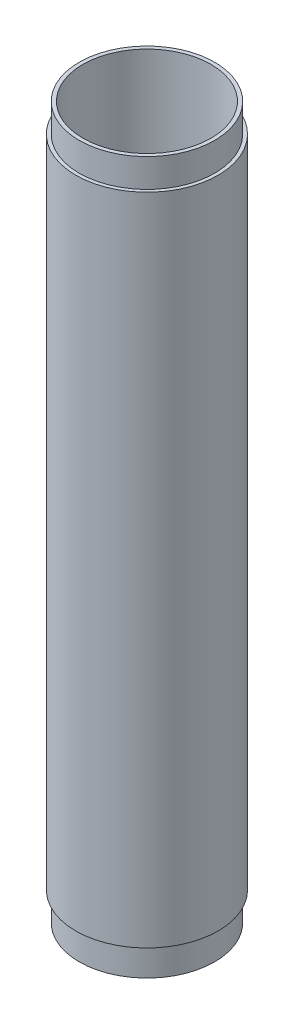
ISO-10303-21;
HEADER;
FILE_DESCRIPTION(('STEP AP214'),'2;1');
FILE_NAME('part.step','',(''),(''),'','','');
FILE_SCHEMA(('AUTOMOTIVE_DESIGN { 1 0 10303 214 1 1 1 1 }'));
ENDSEC;
DATA;
#1=APPLICATION_CONTEXT('core data for automotive mechanical design processes');
#2=APPLICATION_PROTOCOL_DEFINITION('international standard','automotive_design',2000,#1);
#3=PRODUCT_CONTEXT('',#1,'mechanical');
#4=PRODUCT('Part','Part','',(#3));
#5=PRODUCT_RELATED_PRODUCT_CATEGORY('part','',(#4));
#6=PRODUCT_DEFINITION_FORMATION('','',#4);
#7=PRODUCT_DEFINITION_CONTEXT('part definition',#1,'design');
#8=PRODUCT_DEFINITION('design','',#6,#7);
#9=PRODUCT_DEFINITION_SHAPE('','',#8);
#10=(LENGTH_UNIT() NAMED_UNIT(*) SI_UNIT(.MILLI.,.METRE.));
#11=(NAMED_UNIT(*) PLANE_ANGLE_UNIT() SI_UNIT($,.RADIAN.));
#12=(NAMED_UNIT(*) SI_UNIT($,.STERADIAN.) SOLID_ANGLE_UNIT());
#13=UNCERTAINTY_MEASURE_WITH_UNIT(LENGTH_MEASURE(1.E-05),#10,'distance_accuracy_value','');
#14=(GEOMETRIC_REPRESENTATION_CONTEXT(3) GLOBAL_UNCERTAINTY_ASSIGNED_CONTEXT((#13)) GLOBAL_UNIT_ASSIGNED_CONTEXT((#10,
#11,#12)) REPRESENTATION_CONTEXT('',''));
#15=CARTESIAN_POINT('',(0.,0.,0.));
#16=DIRECTION('',(0.,0.,1.));
#17=DIRECTION('',(1.,0.,0.));
#18=AXIS2_PLACEMENT_3D('',#15,#16,#17);
#19=CARTESIAN_POINT('',(0.,0.,0.));
#20=DIRECTION('',(0.,1.,0.));
#21=DIRECTION('',(0.,0.,1.));
#22=AXIS2_PLACEMENT_3D('',#19,#20,#21);
#23=PLANE('',#22);
#24=CARTESIAN_POINT('',(0.,0.,0.));
#25=DIRECTION('',(0.,1.,0.));
#26=DIRECTION('',(0.,0.,1.));
#27=AXIS2_PLACEMENT_3D('',#24,#25,#26);
#28=CIRCLE('',#27,25.);
#29=CARTESIAN_POINT('',(0.,0.,25.));
#30=VERTEX_POINT('',#29);
#31=EDGE_CURVE('E46',#30,#30,#28,.T.);
#32=ORIENTED_EDGE('',*,*,#31,.F.);
#33=EDGE_LOOP('',(#32));
#34=FACE_BOUND('',#33,.T.);
#35=CARTESIAN_POINT('',(0.,0.,0.));
#36=DIRECTION('',(0.,1.,0.));
#37=DIRECTION('',(0.,0.,1.));
#38=AXIS2_PLACEMENT_3D('',#35,#36,#37);
#39=CIRCLE('',#38,23.8);
#40=CARTESIAN_POINT('',(0.,0.,23.8));
#41=VERTEX_POINT('',#40);
#42=EDGE_CURVE('E10',#41,#41,#39,.F.);
#43=ORIENTED_EDGE('',*,*,#42,.F.);
#44=EDGE_LOOP('',(#43));
#45=FACE_BOUND('',#44,.T.);
#46=ADVANCED_FACE('F35',(#34,#45),#23,.F.);
#47=CARTESIAN_POINT('',(0.,230.,0.));
#48=DIRECTION('',(0.,1.,0.));
#49=DIRECTION('',(0.,0.,1.));
#50=AXIS2_PLACEMENT_3D('',#47,#48,#49);
#51=PLANE('',#50);
#52=CARTESIAN_POINT('',(0.,230.,0.));
#53=DIRECTION('',(0.,1.,0.));
#54=DIRECTION('',(0.,0.,1.));
#55=AXIS2_PLACEMENT_3D('',#52,#53,#54);
#56=CIRCLE('',#55,25.);
#57=CARTESIAN_POINT('',(0.,230.,25.));
#58=VERTEX_POINT('',#57);
#59=EDGE_CURVE('E42',#58,#58,#56,.T.);
#60=ORIENTED_EDGE('',*,*,#59,.T.);
#61=EDGE_LOOP('',(#60));
#62=FACE_BOUND('',#61,.T.);
#63=CARTESIAN_POINT('',(0.,230.,0.));
#64=DIRECTION('',(0.,1.,0.));
#65=DIRECTION('',(0.,0.,1.));
#66=AXIS2_PLACEMENT_3D('',#63,#64,#65);
#67=CIRCLE('',#66,23.8);
#68=CARTESIAN_POINT('',(0.,230.,23.8));
#69=VERTEX_POINT('',#68);
#70=EDGE_CURVE('E53',#69,#69,#67,.T.);
#71=ORIENTED_EDGE('',*,*,#70,.F.);
#72=EDGE_LOOP('',(#71));
#73=FACE_BOUND('',#72,.T.);
#74=ADVANCED_FACE('F86',(#62,#73),#51,.T.);
#75=CARTESIAN_POINT('',(0.,230.,0.));
#76=DIRECTION('',(0.,-1.,0.));
#77=DIRECTION('',(0.,0.,-1.));
#78=AXIS2_PLACEMENT_3D('',#75,#76,#77);
#79=CYLINDRICAL_SURFACE('',#78,25.);
#80=ORIENTED_EDGE('',*,*,#59,.F.);
#81=EDGE_LOOP('',(#80));
#82=FACE_BOUND('',#81,.T.);
#83=ORIENTED_EDGE('',*,*,#31,.T.);
#84=EDGE_LOOP('',(#83));
#85=FACE_BOUND('',#84,.T.);
#86=ADVANCED_FACE('F37',(#82,#85),#79,.T.);
#87=CARTESIAN_POINT('',(0.,230.,0.));
#88=DIRECTION('',(0.,-1.,0.));
#89=DIRECTION('',(0.,0.,-1.));
#90=AXIS2_PLACEMENT_3D('',#87,#88,#89);
#91=CYLINDRICAL_SURFACE('',#90,22.5);
#92=CARTESIAN_POINT('',(0.,240.,0.));
#93=DIRECTION('',(0.,1.,0.));
#94=DIRECTION('',(0.,0.,1.));
#95=AXIS2_PLACEMENT_3D('',#92,#93,#94);
#96=CIRCLE('',#95,22.5);
#97=CARTESIAN_POINT('',(0.,240.,22.5));
#98=VERTEX_POINT('',#97);
#99=EDGE_CURVE('E56',#98,#98,#96,.T.);
#100=ORIENTED_EDGE('',*,*,#99,.T.);
#101=EDGE_LOOP('',(#100));
#102=FACE_BOUND('',#101,.T.);
#103=CARTESIAN_POINT('',(0.,-10.,0.));
#104=DIRECTION('',(0.,-1.,0.));
#105=DIRECTION('',(0.,0.,-1.));
#106=AXIS2_PLACEMENT_3D('',#103,#104,#105);
#107=CIRCLE('',#106,22.5);
#108=CARTESIAN_POINT('',(0.,-10.,-22.5));
#109=VERTEX_POINT('',#108);
#110=EDGE_CURVE('E64',#109,#109,#107,.T.);
#111=ORIENTED_EDGE('',*,*,#110,.T.);
#112=EDGE_LOOP('',(#111));
#113=FACE_BOUND('',#112,.T.);
#114=ADVANCED_FACE('F68',(#102,#113),#91,.F.);
#115=CARTESIAN_POINT('',(0.,240.,0.));
#116=DIRECTION('',(0.,1.,0.));
#117=DIRECTION('',(0.,0.,1.));
#118=AXIS2_PLACEMENT_3D('',#115,#116,#117);
#119=PLANE('',#118);
#120=CARTESIAN_POINT('',(0.,240.,0.));
#121=DIRECTION('',(0.,1.,0.));
#122=DIRECTION('',(0.,0.,1.));
#123=AXIS2_PLACEMENT_3D('',#120,#121,#122);
#124=CIRCLE('',#123,23.8);
#125=CARTESIAN_POINT('',(0.,240.,23.8));
#126=VERTEX_POINT('',#125);
#127=EDGE_CURVE('E51',#126,#126,#124,.T.);
#128=ORIENTED_EDGE('',*,*,#127,.T.);
#129=EDGE_LOOP('',(#128));
#130=FACE_BOUND('',#129,.T.);
#131=ORIENTED_EDGE('',*,*,#99,.F.);
#132=EDGE_LOOP('',(#131));
#133=FACE_BOUND('',#132,.T.);
#134=ADVANCED_FACE('F82',(#130,#133),#119,.T.);
#135=CARTESIAN_POINT('',(0.,240.,0.));
#136=DIRECTION('',(0.,-1.,0.));
#137=DIRECTION('',(0.,0.,-1.));
#138=AXIS2_PLACEMENT_3D('',#135,#136,#137);
#139=CYLINDRICAL_SURFACE('',#138,23.8);
#140=ORIENTED_EDGE('',*,*,#127,.F.);
#141=EDGE_LOOP('',(#140));
#142=FACE_BOUND('',#141,.T.);
#143=ORIENTED_EDGE('',*,*,#70,.T.);
#144=EDGE_LOOP('',(#143));
#145=FACE_BOUND('',#144,.T.);
#146=ADVANCED_FACE('F73',(#142,#145),#139,.T.);
#147=CARTESIAN_POINT('',(0.,-10.,0.));
#148=DIRECTION('',(0.,-1.,0.));
#149=DIRECTION('',(0.,0.,-1.));
#150=AXIS2_PLACEMENT_3D('',#147,#148,#149);
#151=PLANE('',#150);
#152=CARTESIAN_POINT('',(0.,-10.,0.));
#153=DIRECTION('',(0.,-1.,0.));
#154=DIRECTION('',(0.,0.,-1.));
#155=AXIS2_PLACEMENT_3D('',#152,#153,#154);
#156=CIRCLE('',#155,23.8);
#157=CARTESIAN_POINT('',(0.,-10.,-23.8));
#158=VERTEX_POINT('',#157);
#159=EDGE_CURVE('E61',#158,#158,#156,.T.);
#160=ORIENTED_EDGE('',*,*,#159,.T.);
#161=EDGE_LOOP('',(#160));
#162=FACE_BOUND('',#161,.T.);
#163=ORIENTED_EDGE('',*,*,#110,.F.);
#164=EDGE_LOOP('',(#163));
#165=FACE_BOUND('',#164,.T.);
#166=ADVANCED_FACE('F70',(#162,#165),#151,.T.);
#167=CARTESIAN_POINT('',(0.,-10.,0.));
#168=DIRECTION('',(0.,1.,0.));
#169=DIRECTION('',(0.,0.,1.));
#170=AXIS2_PLACEMENT_3D('',#167,#168,#169);
#171=CYLINDRICAL_SURFACE('',#170,23.8);
#172=ORIENTED_EDGE('',*,*,#159,.F.);
#173=EDGE_LOOP('',(#172));
#174=FACE_BOUND('',#173,.T.);
#175=ORIENTED_EDGE('',*,*,#42,.T.);
#176=EDGE_LOOP('',(#175));
#177=FACE_BOUND('',#176,.T.);
#178=ADVANCED_FACE('F72',(#174,#177),#171,.T.);
#179=CLOSED_SHELL('',(#46,#74,#86,#114,#134,#146,#166,#178));
#180=MANIFOLD_SOLID_BREP('B2',#179);
#181=ADVANCED_BREP_SHAPE_REPRESENTATION('',(#18,#180),#14);
#182=SHAPE_DEFINITION_REPRESENTATION(#9,#181);
ENDSEC;
END-ISO-10303-21;
